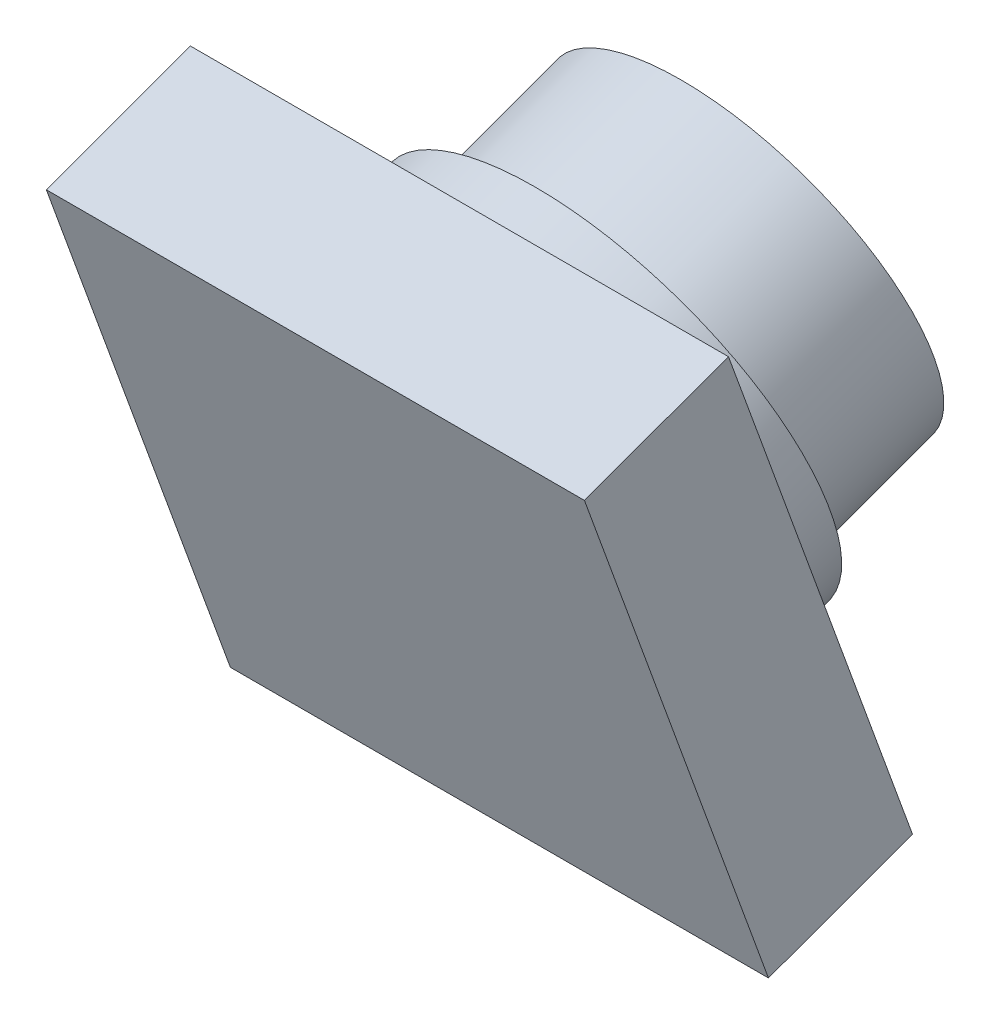
ISO-10303-21;
HEADER;
FILE_DESCRIPTION(('STEP AP214'),'2;1');
FILE_NAME('part.step','',(''),(''),'','','');
FILE_SCHEMA(('AUTOMOTIVE_DESIGN { 1 0 10303 214 1 1 1 1 }'));
ENDSEC;
DATA;
#1=APPLICATION_CONTEXT('core data for automotive mechanical design processes');
#2=APPLICATION_PROTOCOL_DEFINITION('international standard','automotive_design',2000,#1);
#3=PRODUCT_CONTEXT('',#1,'mechanical');
#4=PRODUCT('Part','Part','',(#3));
#5=PRODUCT_RELATED_PRODUCT_CATEGORY('part','',(#4));
#6=PRODUCT_DEFINITION_FORMATION('','',#4);
#7=PRODUCT_DEFINITION_CONTEXT('part definition',#1,'design');
#8=PRODUCT_DEFINITION('design','',#6,#7);
#9=PRODUCT_DEFINITION_SHAPE('','',#8);
#10=(LENGTH_UNIT() NAMED_UNIT(*) SI_UNIT(.MILLI.,.METRE.));
#11=(NAMED_UNIT(*) PLANE_ANGLE_UNIT() SI_UNIT($,.RADIAN.));
#12=(NAMED_UNIT(*) SI_UNIT($,.STERADIAN.) SOLID_ANGLE_UNIT());
#13=UNCERTAINTY_MEASURE_WITH_UNIT(LENGTH_MEASURE(1.E-05),#10,'distance_accuracy_value','');
#14=(GEOMETRIC_REPRESENTATION_CONTEXT(3) GLOBAL_UNCERTAINTY_ASSIGNED_CONTEXT((#13)) GLOBAL_UNIT_ASSIGNED_CONTEXT((#10,
#11,#12)) REPRESENTATION_CONTEXT('',''));
#15=CARTESIAN_POINT('',(0.,0.,0.));
#16=DIRECTION('',(0.,0.,1.));
#17=DIRECTION('',(1.,0.,0.));
#18=AXIS2_PLACEMENT_3D('',#15,#16,#17);
#19=CARTESIAN_POINT('',(-4.3,9.33953697556179,17.8970564889115));
#20=DIRECTION('',(1.,0.,0.));
#21=DIRECTION('',(0.,1.,0.));
#22=AXIS2_PLACEMENT_3D('',#19,#20,#21);
#23=PLANE('',#22);
#24=DIRECTION('',(0.,0.93969262078591,0.342020143325666));
#25=VECTOR('',#24,1.);
#26=CARTESIAN_POINT('',(-4.3,8.50158762441391,20.199303409837));
#27=LINE('',#26,#25);
#28=CARTESIAN_POINT('',(-4.3,0.420231085655088,17.2579301772362));
#29=VERTEX_POINT('',#28);
#30=CARTESIAN_POINT('',(-4.3,8.50158762441391,20.199303409837));
#31=VERTEX_POINT('',#30);
#32=EDGE_CURVE('E104',#29,#31,#27,.T.);
#33=ORIENTED_EDGE('',*,*,#32,.T.);
#34=DIRECTION('',(0.,-0.342020143325666,0.939692620785909));
#35=VECTOR('',#34,1.);
#36=CARTESIAN_POINT('',(-4.3,9.33953697556179,17.8970564889115));
#37=LINE('',#36,#35);
#38=CARTESIAN_POINT('',(-4.3,9.33953697556179,17.8970564889115));
#39=VERTEX_POINT('',#38);
#40=EDGE_CURVE('E11',#39,#31,#37,.T.);
#41=ORIENTED_EDGE('',*,*,#40,.F.);
#42=DIRECTION('',(0.,0.93969262078591,0.342020143325666));
#43=VECTOR('',#42,1.);
#44=CARTESIAN_POINT('',(-4.3,9.33953697556179,17.8970564889115));
#45=LINE('',#44,#43);
#46=CARTESIAN_POINT('',(-4.3,1.25818043680297,14.9556832563107));
#47=VERTEX_POINT('',#46);
#48=EDGE_CURVE('E91',#47,#39,#45,.T.);
#49=ORIENTED_EDGE('',*,*,#48,.F.);
#50=DIRECTION('',(0.,-0.342020143325666,0.939692620785909));
#51=VECTOR('',#50,1.);
#52=CARTESIAN_POINT('',(-4.3,1.25818043680297,14.9556832563107));
#53=LINE('',#52,#51);
#54=EDGE_CURVE('E100',#47,#29,#53,.T.);
#55=ORIENTED_EDGE('',*,*,#54,.T.);
#56=EDGE_LOOP('',(#33,#41,#49,#55));
#57=FACE_BOUND('',#56,.T.);
#58=ADVANCED_FACE('F39',(#57),#23,.F.);
#59=CARTESIAN_POINT('',(4.3,9.33953697556179,17.8970564889115));
#60=DIRECTION('',(0.,-0.939692620785909,-0.342020143325666));
#61=DIRECTION('',(0.,0.342020143325666,-0.939692620785909));
#62=AXIS2_PLACEMENT_3D('',#59,#60,#61);
#63=PLANE('',#62);
#64=DIRECTION('',(1.,0.,0.));
#65=VECTOR('',#64,1.);
#66=CARTESIAN_POINT('',(4.3,8.50158762441391,20.199303409837));
#67=LINE('',#66,#65);
#68=CARTESIAN_POINT('',(4.3,8.50158762441391,20.199303409837));
#69=VERTEX_POINT('',#68);
#70=EDGE_CURVE('E95',#31,#69,#67,.T.);
#71=ORIENTED_EDGE('',*,*,#70,.T.);
#72=DIRECTION('',(0.,-0.342020143325666,0.939692620785909));
#73=VECTOR('',#72,1.);
#74=CARTESIAN_POINT('',(4.3,9.33953697556179,17.8970564889115));
#75=LINE('',#74,#73);
#76=CARTESIAN_POINT('',(4.3,9.33953697556179,17.8970564889115));
#77=VERTEX_POINT('',#76);
#78=EDGE_CURVE('E48',#77,#69,#75,.T.);
#79=ORIENTED_EDGE('',*,*,#78,.F.);
#80=DIRECTION('',(1.,0.,0.));
#81=VECTOR('',#80,1.);
#82=CARTESIAN_POINT('',(4.3,9.33953697556179,17.8970564889115));
#83=LINE('',#82,#81);
#84=EDGE_CURVE('E86',#39,#77,#83,.T.);
#85=ORIENTED_EDGE('',*,*,#84,.F.);
#86=ORIENTED_EDGE('',*,*,#40,.T.);
#87=EDGE_LOOP('',(#71,#79,#85,#86));
#88=FACE_BOUND('',#87,.T.);
#89=ADVANCED_FACE('F94',(#88),#63,.F.);
#90=CARTESIAN_POINT('',(4.3,9.33953697556179,17.8970564889115));
#91=DIRECTION('',(-1.,0.,0.));
#92=DIRECTION('',(0.,-1.,0.));
#93=AXIS2_PLACEMENT_3D('',#90,#91,#92);
#94=PLANE('',#93);
#95=DIRECTION('',(0.,-0.93969262078591,-0.342020143325666));
#96=VECTOR('',#95,1.);
#97=CARTESIAN_POINT('',(4.3,8.50158762441391,20.199303409837));
#98=LINE('',#97,#96);
#99=CARTESIAN_POINT('',(4.3,0.420231085655088,17.2579301772362));
#100=VERTEX_POINT('',#99);
#101=EDGE_CURVE('E73',#69,#100,#98,.T.);
#102=ORIENTED_EDGE('',*,*,#101,.T.);
#103=DIRECTION('',(0.,-0.342020143325666,0.939692620785909));
#104=VECTOR('',#103,1.);
#105=CARTESIAN_POINT('',(4.3,1.25818043680297,14.9556832563107));
#106=LINE('',#105,#104);
#107=CARTESIAN_POINT('',(4.3,1.25818043680297,14.9556832563107));
#108=VERTEX_POINT('',#107);
#109=EDGE_CURVE('E96',#108,#100,#106,.T.);
#110=ORIENTED_EDGE('',*,*,#109,.F.);
#111=DIRECTION('',(0.,-0.93969262078591,-0.342020143325666));
#112=VECTOR('',#111,1.);
#113=CARTESIAN_POINT('',(4.3,9.33953697556179,17.8970564889115));
#114=LINE('',#113,#112);
#115=EDGE_CURVE('E89',#77,#108,#114,.T.);
#116=ORIENTED_EDGE('',*,*,#115,.F.);
#117=ORIENTED_EDGE('',*,*,#78,.T.);
#118=EDGE_LOOP('',(#102,#110,#116,#117));
#119=FACE_BOUND('',#118,.T.);
#120=ADVANCED_FACE('F98',(#119),#94,.F.);
#121=CARTESIAN_POINT('',(4.3,1.25818043680297,14.9556832563107));
#122=DIRECTION('',(0.,0.939692620785909,0.342020143325666));
#123=DIRECTION('',(0.,-0.342020143325666,0.939692620785909));
#124=AXIS2_PLACEMENT_3D('',#121,#122,#123);
#125=PLANE('',#124);
#126=DIRECTION('',(-1.,0.,0.));
#127=VECTOR('',#126,1.);
#128=CARTESIAN_POINT('',(4.3,0.420231085655088,17.2579301772362));
#129=LINE('',#128,#127);
#130=EDGE_CURVE('E79',#100,#29,#129,.T.);
#131=ORIENTED_EDGE('',*,*,#130,.T.);
#132=ORIENTED_EDGE('',*,*,#54,.F.);
#133=DIRECTION('',(-1.,0.,0.));
#134=VECTOR('',#133,1.);
#135=CARTESIAN_POINT('',(4.3,1.25818043680297,14.9556832563107));
#136=LINE('',#135,#134);
#137=EDGE_CURVE('E56',#108,#47,#136,.T.);
#138=ORIENTED_EDGE('',*,*,#137,.F.);
#139=ORIENTED_EDGE('',*,*,#109,.T.);
#140=EDGE_LOOP('',(#131,#132,#138,#139));
#141=FACE_BOUND('',#140,.T.);
#142=ADVANCED_FACE('F112',(#141),#125,.F.);
#143=CARTESIAN_POINT('',(0.,-4.65948479340194,12.8018292561641));
#144=DIRECTION('',(0.,0.342020143325666,-0.939692620785909));
#145=DIRECTION('',(0.,0.939692620785909,0.342020143325666));
#146=AXIS2_PLACEMENT_3D('',#143,#144,#145);
#147=PLANE('',#146);
#148=CARTESIAN_POINT('',(0.,5.29885870618238,16.4263698726111));
#149=DIRECTION('',(0.,0.342020143325666,-0.939692620785909));
#150=DIRECTION('',(0.,0.939692620785909,0.342020143325666));
#151=AXIS2_PLACEMENT_3D('',#148,#149,#150);
#152=CIRCLE('',#151,3.5);
#153=CARTESIAN_POINT('',(0.,8.58778287893306,17.6234403742509));
#154=VERTEX_POINT('',#153);
#155=EDGE_CURVE('E120',#154,#154,#152,.T.);
#156=ORIENTED_EDGE('',*,*,#155,.F.);
#157=EDGE_LOOP('',(#156));
#158=FACE_BOUND('',#157,.T.);
#159=ORIENTED_EDGE('',*,*,#48,.T.);
#160=ORIENTED_EDGE('',*,*,#84,.T.);
#161=ORIENTED_EDGE('',*,*,#115,.T.);
#162=ORIENTED_EDGE('',*,*,#137,.T.);
#163=EDGE_LOOP('',(#159,#160,#161,#162));
#164=FACE_BOUND('',#163,.T.);
#165=ADVANCED_FACE('F87',(#158,#164),#147,.T.);
#166=CARTESIAN_POINT('',(0.,-5.49743414454982,15.1040761770896));
#167=DIRECTION('',(0.,0.342020143325666,-0.939692620785909));
#168=DIRECTION('',(0.,0.939692620785909,0.342020143325666));
#169=AXIS2_PLACEMENT_3D('',#166,#167,#168);
#170=PLANE('',#169);
#171=ORIENTED_EDGE('',*,*,#32,.F.);
#172=ORIENTED_EDGE('',*,*,#130,.F.);
#173=ORIENTED_EDGE('',*,*,#101,.F.);
#174=ORIENTED_EDGE('',*,*,#70,.F.);
#175=EDGE_LOOP('',(#171,#172,#173,#174));
#176=FACE_BOUND('',#175,.T.);
#177=ADVANCED_FACE('F115',(#176),#170,.F.);
#178=CARTESIAN_POINT('',(0.,5.64087884950805,15.4866772518252));
#179=DIRECTION('',(0.,-0.342020143325666,0.939692620785909));
#180=DIRECTION('',(0.,-0.939692620785909,-0.342020143325666));
#181=AXIS2_PLACEMENT_3D('',#178,#179,#180);
#182=CYLINDRICAL_SURFACE('',#181,3.5);
#183=CARTESIAN_POINT('',(0.,5.64087884950805,15.4866772518252));
#184=DIRECTION('',(0.,0.342020143325666,-0.939692620785909));
#185=DIRECTION('',(0.,0.939692620785909,0.342020143325666));
#186=AXIS2_PLACEMENT_3D('',#183,#184,#185);
#187=CIRCLE('',#186,3.5);
#188=CARTESIAN_POINT('',(0.,8.92980302225873,16.683747753465));
#189=VERTEX_POINT('',#188);
#190=EDGE_CURVE('E123',#189,#189,#187,.T.);
#191=ORIENTED_EDGE('',*,*,#190,.F.);
#192=EDGE_LOOP('',(#191));
#193=FACE_BOUND('',#192,.T.);
#194=ORIENTED_EDGE('',*,*,#155,.T.);
#195=EDGE_LOOP('',(#194));
#196=FACE_BOUND('',#195,.T.);
#197=ADVANCED_FACE('F136',(#193,#196),#182,.T.);
#198=CARTESIAN_POINT('',(0.,5.64087884950805,15.4866772518252));
#199=DIRECTION('',(0.,0.342020143325666,-0.939692620785909));
#200=DIRECTION('',(0.,0.939692620785909,0.342020143325666));
#201=AXIS2_PLACEMENT_3D('',#198,#199,#200);
#202=PLANE('',#201);
#203=CARTESIAN_POINT('',(0.,5.64087884950805,15.4866772518252));
#204=DIRECTION('',(0.,0.342020143325666,-0.939692620785909));
#205=DIRECTION('',(0.,0.939692620785909,0.342020143325666));
#206=AXIS2_PLACEMENT_3D('',#203,#204,#205);
#207=CIRCLE('',#206,3.);
#208=CARTESIAN_POINT('',(0.,8.45995671186578,16.5127376818022));
#209=VERTEX_POINT('',#208);
#210=EDGE_CURVE('E42',#209,#209,#207,.T.);
#211=ORIENTED_EDGE('',*,*,#210,.F.);
#212=EDGE_LOOP('',(#211));
#213=FACE_BOUND('',#212,.T.);
#214=ORIENTED_EDGE('',*,*,#190,.T.);
#215=EDGE_LOOP('',(#214));
#216=FACE_BOUND('',#215,.T.);
#217=ADVANCED_FACE('F133',(#213,#216),#202,.T.);
#218=CARTESIAN_POINT('',(0.,6.42752517915708,13.3253842240176));
#219=DIRECTION('',(0.,0.342020143325666,-0.939692620785909));
#220=DIRECTION('',(0.,0.939692620785909,0.342020143325666));
#221=AXIS2_PLACEMENT_3D('',#218,#219,#220);
#222=PLANE('',#221);
#223=CARTESIAN_POINT('',(0.,6.42752517915708,13.3253842240176));
#224=DIRECTION('',(0.,0.342020143325666,-0.939692620785909));
#225=DIRECTION('',(0.,0.939692620785909,0.342020143325666));
#226=AXIS2_PLACEMENT_3D('',#223,#224,#225);
#227=CIRCLE('',#226,3.);
#228=CARTESIAN_POINT('',(0.,9.24660304151481,14.3514446539946));
#229=VERTEX_POINT('',#228);
#230=EDGE_CURVE('E107',#229,#229,#227,.T.);
#231=ORIENTED_EDGE('',*,*,#230,.T.);
#232=EDGE_LOOP('',(#231));
#233=FACE_BOUND('',#232,.T.);
#234=ADVANCED_FACE('F135',(#233),#222,.T.);
#235=CARTESIAN_POINT('',(0.,6.42752517915708,13.3253842240176));
#236=DIRECTION('',(0.,-0.342020143325666,0.93969262078591));
#237=DIRECTION('',(0.,-0.93969262078591,-0.342020143325666));
#238=AXIS2_PLACEMENT_3D('',#235,#236,#237);
#239=CYLINDRICAL_SURFACE('',#238,3.);
#240=ORIENTED_EDGE('',*,*,#210,.T.);
#241=EDGE_LOOP('',(#240));
#242=FACE_BOUND('',#241,.T.);
#243=ORIENTED_EDGE('',*,*,#230,.F.);
#244=EDGE_LOOP('',(#243));
#245=FACE_BOUND('',#244,.T.);
#246=ADVANCED_FACE('F130',(#242,#245),#239,.T.);
#247=CLOSED_SHELL('',(#58,#89,#120,#142,#165,#177,#197,#217,#234,#246));
#248=MANIFOLD_SOLID_BREP('B2',#247);
#249=ADVANCED_BREP_SHAPE_REPRESENTATION('',(#18,#248),#14);
#250=SHAPE_DEFINITION_REPRESENTATION(#9,#249);
ENDSEC;
END-ISO-10303-21;
